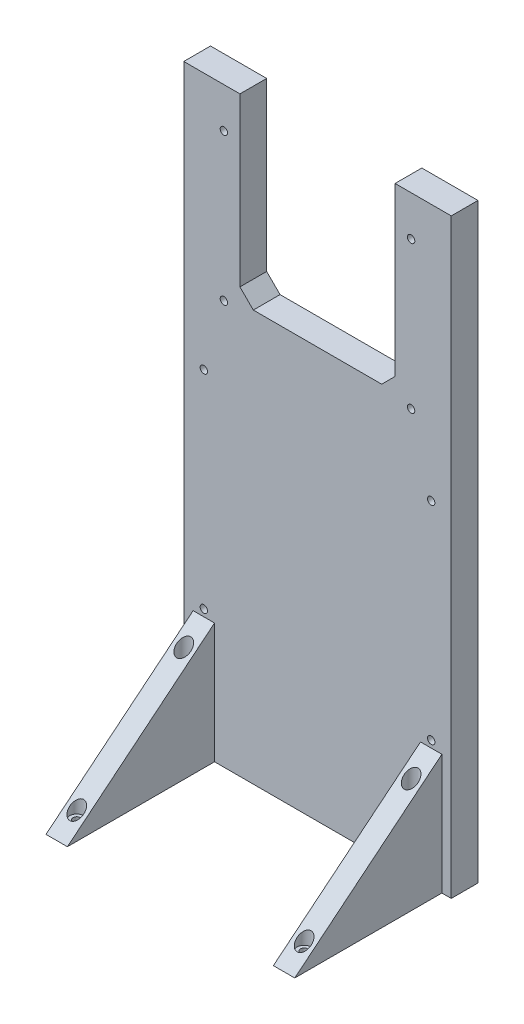
ISO-10303-21;
HEADER;
FILE_DESCRIPTION(('STEP AP214'),'2;1');
FILE_NAME('part.step','',(''),(''),'','','');
FILE_SCHEMA(('AUTOMOTIVE_DESIGN { 1 0 10303 214 1 1 1 1 }'));
ENDSEC;
DATA;
#1=APPLICATION_CONTEXT('core data for automotive mechanical design processes');
#2=APPLICATION_PROTOCOL_DEFINITION('international standard','automotive_design',2000,#1);
#3=PRODUCT_CONTEXT('',#1,'mechanical');
#4=PRODUCT('Part','Part','',(#3));
#5=PRODUCT_RELATED_PRODUCT_CATEGORY('part','',(#4));
#6=PRODUCT_DEFINITION_FORMATION('','',#4);
#7=PRODUCT_DEFINITION_CONTEXT('part definition',#1,'design');
#8=PRODUCT_DEFINITION('design','',#6,#7);
#9=PRODUCT_DEFINITION_SHAPE('','',#8);
#10=(LENGTH_UNIT() NAMED_UNIT(*) SI_UNIT(.MILLI.,.METRE.));
#11=(NAMED_UNIT(*) PLANE_ANGLE_UNIT() SI_UNIT($,.RADIAN.));
#12=(NAMED_UNIT(*) SI_UNIT($,.STERADIAN.) SOLID_ANGLE_UNIT());
#13=UNCERTAINTY_MEASURE_WITH_UNIT(LENGTH_MEASURE(1.E-05),#10,'distance_accuracy_value','');
#14=(GEOMETRIC_REPRESENTATION_CONTEXT(3) GLOBAL_UNCERTAINTY_ASSIGNED_CONTEXT((#13)) GLOBAL_UNIT_ASSIGNED_CONTEXT((#10,
#11,#12)) REPRESENTATION_CONTEXT('',''));
#15=CARTESIAN_POINT('',(0.,0.,0.));
#16=DIRECTION('',(0.,0.,1.));
#17=DIRECTION('',(1.,0.,0.));
#18=AXIS2_PLACEMENT_3D('',#15,#16,#17);
#19=CARTESIAN_POINT('',(0.,0.,0.));
#20=DIRECTION('',(0.,0.,1.));
#21=DIRECTION('',(1.,0.,0.));
#22=AXIS2_PLACEMENT_3D('',#19,#20,#21);
#23=PLANE('',#22);
#24=CARTESIAN_POINT('',(-35.,40.52,0.));
#25=DIRECTION('',(0.,0.,1.));
#26=DIRECTION('',(1.,0.,0.));
#27=AXIS2_PLACEMENT_3D('',#24,#25,#26);
#28=CIRCLE('',#27,1.375);
#29=CARTESIAN_POINT('',(-33.625,40.52,0.));
#30=VERTEX_POINT('',#29);
#31=EDGE_CURVE('E1003',#30,#30,#28,.F.);
#32=ORIENTED_EDGE('',*,*,#31,.F.);
#33=EDGE_LOOP('',(#32));
#34=FACE_BOUND('',#33,.T.);
#35=CARTESIAN_POINT('',(35.,40.52,0.));
#36=DIRECTION('',(0.,0.,1.));
#37=DIRECTION('',(1.,0.,0.));
#38=AXIS2_PLACEMENT_3D('',#35,#36,#37);
#39=CIRCLE('',#38,1.375);
#40=CARTESIAN_POINT('',(36.375,40.52,0.));
#41=VERTEX_POINT('',#40);
#42=EDGE_CURVE('E1007',#41,#41,#39,.F.);
#43=ORIENTED_EDGE('',*,*,#42,.F.);
#44=EDGE_LOOP('',(#43));
#45=FACE_BOUND('',#44,.T.);
#46=CARTESIAN_POINT('',(35.,95.5,0.));
#47=DIRECTION('',(0.,0.,1.));
#48=DIRECTION('',(1.,0.,0.));
#49=AXIS2_PLACEMENT_3D('',#46,#47,#48);
#50=CIRCLE('',#49,1.375);
#51=CARTESIAN_POINT('',(36.375,95.5,0.));
#52=VERTEX_POINT('',#51);
#53=EDGE_CURVE('E1031',#52,#52,#50,.F.);
#54=ORIENTED_EDGE('',*,*,#53,.F.);
#55=EDGE_LOOP('',(#54));
#56=FACE_BOUND('',#55,.T.);
#57=CARTESIAN_POINT('',(-35.,95.5,0.));
#58=DIRECTION('',(0.,0.,1.));
#59=DIRECTION('',(1.,0.,0.));
#60=AXIS2_PLACEMENT_3D('',#57,#58,#59);
#61=CIRCLE('',#60,1.375);
#62=CARTESIAN_POINT('',(-33.625,95.5,0.));
#63=VERTEX_POINT('',#62);
#64=EDGE_CURVE('E549',#63,#63,#61,.F.);
#65=ORIENTED_EDGE('',*,*,#64,.F.);
#66=EDGE_LOOP('',(#65));
#67=FACE_BOUND('',#66,.T.);
#68=CARTESIAN_POINT('',(42.5000000000001,-63.,0.));
#69=DIRECTION('',(0.,0.,1.));
#70=DIRECTION('',(1.,0.,0.));
#71=AXIS2_PLACEMENT_3D('',#68,#69,#70);
#72=CIRCLE('',#71,1.375);
#73=CARTESIAN_POINT('',(43.8750000000001,-63.,0.));
#74=VERTEX_POINT('',#73);
#75=EDGE_CURVE('E264',#74,#74,#72,.F.);
#76=ORIENTED_EDGE('',*,*,#75,.F.);
#77=EDGE_LOOP('',(#76));
#78=FACE_BOUND('',#77,.T.);
#79=CARTESIAN_POINT('',(42.5,14.5,0.));
#80=DIRECTION('',(0.,0.,1.));
#81=DIRECTION('',(1.,0.,0.));
#82=AXIS2_PLACEMENT_3D('',#79,#80,#81);
#83=CIRCLE('',#82,1.37500000000001);
#84=CARTESIAN_POINT('',(43.875,14.5,0.));
#85=VERTEX_POINT('',#84);
#86=EDGE_CURVE('E323',#85,#85,#83,.F.);
#87=ORIENTED_EDGE('',*,*,#86,.F.);
#88=EDGE_LOOP('',(#87));
#89=FACE_BOUND('',#88,.T.);
#90=DIRECTION('',(0.,1.,0.));
#91=VECTOR('',#90,1.);
#92=CARTESIAN_POINT('',(-29.,0.,0.));
#93=LINE('',#92,#91);
#94=CARTESIAN_POINT('',(-29.,48.01,0.));
#95=VERTEX_POINT('',#94);
#96=CARTESIAN_POINT('',(-29.,110.5,0.));
#97=VERTEX_POINT('',#96);
#98=EDGE_CURVE('E305',#95,#97,#93,.T.);
#99=ORIENTED_EDGE('',*,*,#98,.F.);
#100=DIRECTION('',(0.707106781186544,-0.707106781186551,0.));
#101=VECTOR('',#100,1.);
#102=CARTESIAN_POINT('',(9.50499999999984,9.50499999999974,0.));
#103=LINE('',#102,#101);
#104=CARTESIAN_POINT('',(-24.,43.01,0.));
#105=VERTEX_POINT('',#104);
#106=EDGE_CURVE('E352',#95,#105,#103,.T.);
#107=ORIENTED_EDGE('',*,*,#106,.T.);
#108=DIRECTION('',(1.,0.,0.));
#109=VECTOR('',#108,1.);
#110=CARTESIAN_POINT('',(0.,43.01,0.));
#111=LINE('',#110,#109);
#112=CARTESIAN_POINT('',(24.,43.01,0.));
#113=VERTEX_POINT('',#112);
#114=EDGE_CURVE('E302',#105,#113,#111,.T.);
#115=ORIENTED_EDGE('',*,*,#114,.T.);
#116=DIRECTION('',(-0.707106781186551,-0.707106781186544,0.));
#117=VECTOR('',#116,1.);
#118=CARTESIAN_POINT('',(-9.50500000000013,9.50500000000023,0.));
#119=LINE('',#118,#117);
#120=CARTESIAN_POINT('',(29.,48.0099999999999,0.));
#121=VERTEX_POINT('',#120);
#122=EDGE_CURVE('E356',#113,#121,#119,.F.);
#123=ORIENTED_EDGE('',*,*,#122,.T.);
#124=DIRECTION('',(0.,1.,0.));
#125=VECTOR('',#124,1.);
#126=CARTESIAN_POINT('',(29.,0.,0.));
#127=LINE('',#126,#125);
#128=CARTESIAN_POINT('',(29.,110.5,0.));
#129=VERTEX_POINT('',#128);
#130=EDGE_CURVE('E321',#121,#129,#127,.T.);
#131=ORIENTED_EDGE('',*,*,#130,.T.);
#132=DIRECTION('',(1.,0.,0.));
#133=VECTOR('',#132,1.);
#134=CARTESIAN_POINT('',(0.,110.5,0.));
#135=LINE('',#134,#133);
#136=CARTESIAN_POINT('',(50.,110.5,0.));
#137=VERTEX_POINT('',#136);
#138=EDGE_CURVE('E318',#129,#137,#135,.T.);
#139=ORIENTED_EDGE('',*,*,#138,.T.);
#140=DIRECTION('',(0.,1.,0.));
#141=VECTOR('',#140,1.);
#142=CARTESIAN_POINT('',(50.,0.,0.));
#143=LINE('',#142,#141);
#144=CARTESIAN_POINT('',(50.,-110.5,0.));
#145=VERTEX_POINT('',#144);
#146=EDGE_CURVE('E315',#145,#137,#143,.T.);
#147=ORIENTED_EDGE('',*,*,#146,.F.);
#148=DIRECTION('',(1.,0.,0.));
#149=VECTOR('',#148,1.);
#150=CARTESIAN_POINT('',(0.,-110.5,0.));
#151=LINE('',#150,#149);
#152=CARTESIAN_POINT('',(-50.,-110.5,0.));
#153=VERTEX_POINT('',#152);
#154=EDGE_CURVE('E313',#153,#145,#151,.T.);
#155=ORIENTED_EDGE('',*,*,#154,.F.);
#156=DIRECTION('',(0.,1.,0.));
#157=VECTOR('',#156,1.);
#158=CARTESIAN_POINT('',(-50.,0.,0.));
#159=LINE('',#158,#157);
#160=CARTESIAN_POINT('',(-50.,110.5,0.));
#161=VERTEX_POINT('',#160);
#162=EDGE_CURVE('E310',#153,#161,#159,.T.);
#163=ORIENTED_EDGE('',*,*,#162,.T.);
#164=DIRECTION('',(1.,0.,0.));
#165=VECTOR('',#164,1.);
#166=CARTESIAN_POINT('',(0.,110.5,0.));
#167=LINE('',#166,#165);
#168=EDGE_CURVE('E307',#161,#97,#167,.T.);
#169=ORIENTED_EDGE('',*,*,#168,.T.);
#170=EDGE_LOOP('',(#99,#107,#115,#123,#131,#139,#147,#155,#163,#169));
#171=FACE_BOUND('',#170,.T.);
#172=CARTESIAN_POINT('',(-42.5,14.5,0.));
#173=DIRECTION('',(0.,0.,1.));
#174=DIRECTION('',(1.,0.,0.));
#175=AXIS2_PLACEMENT_3D('',#172,#173,#174);
#176=CIRCLE('',#175,1.375);
#177=CARTESIAN_POINT('',(-41.125,14.5,0.));
#178=VERTEX_POINT('',#177);
#179=EDGE_CURVE('E299',#178,#178,#176,.T.);
#180=ORIENTED_EDGE('',*,*,#179,.T.);
#181=EDGE_LOOP('',(#180));
#182=FACE_BOUND('',#181,.T.);
#183=CARTESIAN_POINT('',(-42.5,-63.,0.));
#184=DIRECTION('',(0.,0.,1.));
#185=DIRECTION('',(1.,0.,0.));
#186=AXIS2_PLACEMENT_3D('',#183,#184,#185);
#187=CIRCLE('',#186,1.375);
#188=CARTESIAN_POINT('',(-41.125,-63.,0.));
#189=VERTEX_POINT('',#188);
#190=EDGE_CURVE('E259',#189,#189,#187,.T.);
#191=ORIENTED_EDGE('',*,*,#190,.T.);
#192=EDGE_LOOP('',(#191));
#193=FACE_BOUND('',#192,.T.);
#194=CARTESIAN_POINT('',(-42.5,-103.,0.));
#195=DIRECTION('',(0.,0.,1.));
#196=DIRECTION('',(1.,0.,0.));
#197=AXIS2_PLACEMENT_3D('',#194,#195,#196);
#198=CIRCLE('',#197,1.375);
#199=CARTESIAN_POINT('',(-41.125,-103.,0.));
#200=VERTEX_POINT('',#199);
#201=EDGE_CURVE('E533',#200,#200,#198,.T.);
#202=ORIENTED_EDGE('',*,*,#201,.T.);
#203=EDGE_LOOP('',(#202));
#204=FACE_BOUND('',#203,.T.);
#205=CARTESIAN_POINT('',(42.5000000000001,-103.,0.));
#206=DIRECTION('',(0.,0.,-1.));
#207=DIRECTION('',(-1.,0.,0.));
#208=AXIS2_PLACEMENT_3D('',#205,#206,#207);
#209=CIRCLE('',#208,1.37500000000001);
#210=CARTESIAN_POINT('',(41.1250000000001,-103.,0.));
#211=VERTEX_POINT('',#210);
#212=EDGE_CURVE('E536',#211,#211,#209,.T.);
#213=ORIENTED_EDGE('',*,*,#212,.F.);
#214=EDGE_LOOP('',(#213));
#215=FACE_BOUND('',#214,.T.);
#216=ADVANCED_FACE('F97',(#34,#45,#56,#67,#78,#89,#171,#182,#193,#204,#215),#23,.F.);
#217=CARTESIAN_POINT('',(42.5,-110.5,57.5));
#218=DIRECTION('',(0.,1.,0.));
#219=DIRECTION('',(0.,0.,1.));
#220=AXIS2_PLACEMENT_3D('',#217,#218,#219);
#221=CYLINDRICAL_SURFACE('',#220,1.375);
#222=CARTESIAN_POINT('',(42.5,-110.5,57.5));
#223=DIRECTION('',(0.,1.,0.));
#224=DIRECTION('',(0.,0.,1.));
#225=AXIS2_PLACEMENT_3D('',#222,#223,#224);
#226=CIRCLE('',#225,1.375);
#227=CARTESIAN_POINT('',(42.5,-110.5,58.875));
#228=VERTEX_POINT('',#227);
#229=EDGE_CURVE('E388',#228,#228,#226,.T.);
#230=ORIENTED_EDGE('',*,*,#229,.F.);
#231=EDGE_LOOP('',(#230));
#232=FACE_BOUND('',#231,.T.);
#233=CARTESIAN_POINT('',(42.5,-107.5,57.5));
#234=DIRECTION('',(0.,1.,0.));
#235=DIRECTION('',(-1.,0.,0.));
#236=AXIS2_PLACEMENT_3D('',#233,#234,#235);
#237=CIRCLE('',#236,1.375);
#238=CARTESIAN_POINT('',(41.125,-107.5,57.5));
#239=VERTEX_POINT('',#238);
#240=EDGE_CURVE('E369',#239,#239,#237,.F.);
#241=ORIENTED_EDGE('',*,*,#240,.F.);
#242=EDGE_LOOP('',(#241));
#243=FACE_BOUND('',#242,.T.);
#244=ADVANCED_FACE('F408',(#232,#243),#221,.F.);
#245=CARTESIAN_POINT('',(42.5,-110.5,17.5));
#246=DIRECTION('',(0.,1.,0.));
#247=DIRECTION('',(0.,0.,1.));
#248=AXIS2_PLACEMENT_3D('',#245,#246,#247);
#249=CYLINDRICAL_SURFACE('',#248,1.375);
#250=CARTESIAN_POINT('',(42.5,-110.5,17.5));
#251=DIRECTION('',(0.,1.,0.));
#252=DIRECTION('',(0.,0.,1.));
#253=AXIS2_PLACEMENT_3D('',#250,#251,#252);
#254=CIRCLE('',#253,1.375);
#255=CARTESIAN_POINT('',(42.5,-110.5,18.875));
#256=VERTEX_POINT('',#255);
#257=EDGE_CURVE('E384',#256,#256,#254,.T.);
#258=ORIENTED_EDGE('',*,*,#257,.F.);
#259=EDGE_LOOP('',(#258));
#260=FACE_BOUND('',#259,.T.);
#261=CARTESIAN_POINT('',(42.5,-107.5,17.5));
#262=DIRECTION('',(0.,1.,0.));
#263=DIRECTION('',(-1.,0.,0.));
#264=AXIS2_PLACEMENT_3D('',#261,#262,#263);
#265=CIRCLE('',#264,1.375);
#266=CARTESIAN_POINT('',(41.125,-107.5,17.5));
#267=VERTEX_POINT('',#266);
#268=EDGE_CURVE('E366',#267,#267,#265,.F.);
#269=ORIENTED_EDGE('',*,*,#268,.F.);
#270=EDGE_LOOP('',(#269));
#271=FACE_BOUND('',#270,.T.);
#272=ADVANCED_FACE('F414',(#260,#271),#249,.F.);
#273=CARTESIAN_POINT('',(-42.5,-110.5,17.5));
#274=DIRECTION('',(0.,1.,0.));
#275=DIRECTION('',(0.,0.,1.));
#276=AXIS2_PLACEMENT_3D('',#273,#274,#275);
#277=CYLINDRICAL_SURFACE('',#276,1.375);
#278=CARTESIAN_POINT('',(-42.5,-110.5,17.5));
#279=DIRECTION('',(0.,1.,0.));
#280=DIRECTION('',(0.,0.,1.));
#281=AXIS2_PLACEMENT_3D('',#278,#279,#280);
#282=CIRCLE('',#281,1.375);
#283=CARTESIAN_POINT('',(-42.5,-110.5,18.875));
#284=VERTEX_POINT('',#283);
#285=EDGE_CURVE('E244',#284,#284,#282,.T.);
#286=ORIENTED_EDGE('',*,*,#285,.F.);
#287=EDGE_LOOP('',(#286));
#288=FACE_BOUND('',#287,.T.);
#289=CARTESIAN_POINT('',(-42.5,-107.5,17.5));
#290=DIRECTION('',(0.,1.,0.));
#291=DIRECTION('',(-1.,0.,0.));
#292=AXIS2_PLACEMENT_3D('',#289,#290,#291);
#293=CIRCLE('',#292,1.375);
#294=CARTESIAN_POINT('',(-43.875,-107.5,17.5));
#295=VERTEX_POINT('',#294);
#296=EDGE_CURVE('E362',#295,#295,#293,.F.);
#297=ORIENTED_EDGE('',*,*,#296,.F.);
#298=EDGE_LOOP('',(#297));
#299=FACE_BOUND('',#298,.T.);
#300=ADVANCED_FACE('F605',(#288,#299),#277,.F.);
#301=CARTESIAN_POINT('',(-42.5,-110.5,57.5));
#302=DIRECTION('',(0.,1.,0.));
#303=DIRECTION('',(0.,0.,1.));
#304=AXIS2_PLACEMENT_3D('',#301,#302,#303);
#305=CYLINDRICAL_SURFACE('',#304,1.375);
#306=CARTESIAN_POINT('',(-42.5,-110.5,57.5));
#307=DIRECTION('',(0.,1.,0.));
#308=DIRECTION('',(0.,0.,1.));
#309=AXIS2_PLACEMENT_3D('',#306,#307,#308);
#310=CIRCLE('',#309,1.375);
#311=CARTESIAN_POINT('',(-42.5,-110.5,58.875));
#312=VERTEX_POINT('',#311);
#313=EDGE_CURVE('E560',#312,#312,#310,.T.);
#314=ORIENTED_EDGE('',*,*,#313,.F.);
#315=EDGE_LOOP('',(#314));
#316=FACE_BOUND('',#315,.T.);
#317=CARTESIAN_POINT('',(-42.5,-107.5,57.5));
#318=DIRECTION('',(0.,1.,0.));
#319=DIRECTION('',(-1.,0.,0.));
#320=AXIS2_PLACEMENT_3D('',#317,#318,#319);
#321=CIRCLE('',#320,1.375);
#322=CARTESIAN_POINT('',(-43.875,-107.5,57.5));
#323=VERTEX_POINT('',#322);
#324=EDGE_CURVE('E359',#323,#323,#321,.F.);
#325=ORIENTED_EDGE('',*,*,#324,.F.);
#326=EDGE_LOOP('',(#325));
#327=FACE_BOUND('',#326,.T.);
#328=ADVANCED_FACE('F603',(#316,#327),#305,.F.);
#329=CARTESIAN_POINT('',(0.,0.,10.));
#330=DIRECTION('',(0.,0.,1.));
#331=DIRECTION('',(1.,0.,0.));
#332=AXIS2_PLACEMENT_3D('',#329,#330,#331);
#333=PLANE('',#332);
#334=CARTESIAN_POINT('',(-35.,40.52,10.));
#335=DIRECTION('',(0.,0.,1.));
#336=DIRECTION('',(1.,0.,0.));
#337=AXIS2_PLACEMENT_3D('',#334,#335,#336);
#338=CIRCLE('',#337,1.375);
#339=CARTESIAN_POINT('',(-33.625,40.52,10.));
#340=VERTEX_POINT('',#339);
#341=EDGE_CURVE('E1006',#340,#340,#338,.T.);
#342=ORIENTED_EDGE('',*,*,#341,.F.);
#343=EDGE_LOOP('',(#342));
#344=FACE_BOUND('',#343,.T.);
#345=CARTESIAN_POINT('',(35.,40.52,10.));
#346=DIRECTION('',(0.,0.,1.));
#347=DIRECTION('',(1.,0.,0.));
#348=AXIS2_PLACEMENT_3D('',#345,#346,#347);
#349=CIRCLE('',#348,1.375);
#350=CARTESIAN_POINT('',(36.375,40.52,10.));
#351=VERTEX_POINT('',#350);
#352=EDGE_CURVE('E1010',#351,#351,#349,.T.);
#353=ORIENTED_EDGE('',*,*,#352,.F.);
#354=EDGE_LOOP('',(#353));
#355=FACE_BOUND('',#354,.T.);
#356=CARTESIAN_POINT('',(35.,95.5,10.));
#357=DIRECTION('',(0.,0.,1.));
#358=DIRECTION('',(1.,0.,0.));
#359=AXIS2_PLACEMENT_3D('',#356,#357,#358);
#360=CIRCLE('',#359,1.375);
#361=CARTESIAN_POINT('',(36.375,95.5,10.));
#362=VERTEX_POINT('',#361);
#363=EDGE_CURVE('E1017',#362,#362,#360,.T.);
#364=ORIENTED_EDGE('',*,*,#363,.F.);
#365=EDGE_LOOP('',(#364));
#366=FACE_BOUND('',#365,.T.);
#367=CARTESIAN_POINT('',(-35.,95.5,10.));
#368=DIRECTION('',(0.,0.,1.));
#369=DIRECTION('',(1.,0.,0.));
#370=AXIS2_PLACEMENT_3D('',#367,#368,#369);
#371=CIRCLE('',#370,1.375);
#372=CARTESIAN_POINT('',(-33.625,95.5,10.));
#373=VERTEX_POINT('',#372);
#374=EDGE_CURVE('E1015',#373,#373,#371,.T.);
#375=ORIENTED_EDGE('',*,*,#374,.F.);
#376=EDGE_LOOP('',(#375));
#377=FACE_BOUND('',#376,.T.);
#378=DIRECTION('',(0.,-1.,0.));
#379=VECTOR('',#378,1.);
#380=CARTESIAN_POINT('',(38.5,0.,10.));
#381=LINE('',#380,#379);
#382=CARTESIAN_POINT('',(38.5,-65.5631151562895,10.));
#383=VERTEX_POINT('',#382);
#384=CARTESIAN_POINT('',(38.5,-110.5,10.));
#385=VERTEX_POINT('',#384);
#386=EDGE_CURVE('E136',#383,#385,#381,.T.);
#387=ORIENTED_EDGE('',*,*,#386,.F.);
#388=DIRECTION('',(1.,0.,0.));
#389=VECTOR('',#388,1.);
#390=CARTESIAN_POINT('',(0.,-65.5631151562895,10.));
#391=LINE('',#390,#389);
#392=CARTESIAN_POINT('',(46.5,-65.5631151562895,10.));
#393=VERTEX_POINT('',#392);
#394=EDGE_CURVE('E107',#383,#393,#391,.T.);
#395=ORIENTED_EDGE('',*,*,#394,.T.);
#396=DIRECTION('',(0.,-1.,0.));
#397=VECTOR('',#396,1.);
#398=CARTESIAN_POINT('',(46.5,0.,10.));
#399=LINE('',#398,#397);
#400=CARTESIAN_POINT('',(46.5,-110.5,10.));
#401=VERTEX_POINT('',#400);
#402=EDGE_CURVE('E240',#393,#401,#399,.T.);
#403=ORIENTED_EDGE('',*,*,#402,.T.);
#404=DIRECTION('',(1.,0.,0.));
#405=VECTOR('',#404,1.);
#406=CARTESIAN_POINT('',(0.,-110.5,10.));
#407=LINE('',#406,#405);
#408=CARTESIAN_POINT('',(50.,-110.5,10.));
#409=VERTEX_POINT('',#408);
#410=EDGE_CURVE('E278',#401,#409,#407,.T.);
#411=ORIENTED_EDGE('',*,*,#410,.T.);
#412=DIRECTION('',(0.,1.,0.));
#413=VECTOR('',#412,1.);
#414=CARTESIAN_POINT('',(50.,0.,10.));
#415=LINE('',#414,#413);
#416=CARTESIAN_POINT('',(50.,110.5,10.));
#417=VERTEX_POINT('',#416);
#418=EDGE_CURVE('E282',#409,#417,#415,.T.);
#419=ORIENTED_EDGE('',*,*,#418,.T.);
#420=DIRECTION('',(1.,0.,0.));
#421=VECTOR('',#420,1.);
#422=CARTESIAN_POINT('',(0.,110.5,10.));
#423=LINE('',#422,#421);
#424=CARTESIAN_POINT('',(29.,110.5,10.));
#425=VERTEX_POINT('',#424);
#426=EDGE_CURVE('E285',#425,#417,#423,.T.);
#427=ORIENTED_EDGE('',*,*,#426,.F.);
#428=DIRECTION('',(0.,1.,0.));
#429=VECTOR('',#428,1.);
#430=CARTESIAN_POINT('',(29.,0.,10.));
#431=LINE('',#430,#429);
#432=CARTESIAN_POINT('',(29.,48.0099999999999,10.));
#433=VERTEX_POINT('',#432);
#434=EDGE_CURVE('E288',#433,#425,#431,.T.);
#435=ORIENTED_EDGE('',*,*,#434,.F.);
#436=DIRECTION('',(0.707106781186551,0.707106781186544,0.));
#437=VECTOR('',#436,1.);
#438=CARTESIAN_POINT('',(24.,43.01,10.));
#439=LINE('',#438,#437);
#440=CARTESIAN_POINT('',(24.,43.01,10.));
#441=VERTEX_POINT('',#440);
#442=EDGE_CURVE('E223',#433,#441,#439,.F.);
#443=ORIENTED_EDGE('',*,*,#442,.T.);
#444=DIRECTION('',(1.,0.,0.));
#445=VECTOR('',#444,1.);
#446=CARTESIAN_POINT('',(0.,43.01,10.));
#447=LINE('',#446,#445);
#448=CARTESIAN_POINT('',(-24.,43.01,10.));
#449=VERTEX_POINT('',#448);
#450=EDGE_CURVE('E267',#449,#441,#447,.T.);
#451=ORIENTED_EDGE('',*,*,#450,.F.);
#452=DIRECTION('',(-0.707106781186544,0.707106781186551,0.));
#453=VECTOR('',#452,1.);
#454=CARTESIAN_POINT('',(-29.,48.01,10.));
#455=LINE('',#454,#453);
#456=CARTESIAN_POINT('',(-29.,48.01,10.));
#457=VERTEX_POINT('',#456);
#458=EDGE_CURVE('E354',#449,#457,#455,.T.);
#459=ORIENTED_EDGE('',*,*,#458,.T.);
#460=DIRECTION('',(0.,1.,0.));
#461=VECTOR('',#460,1.);
#462=CARTESIAN_POINT('',(-29.,0.,10.));
#463=LINE('',#462,#461);
#464=CARTESIAN_POINT('',(-29.,110.5,10.));
#465=VERTEX_POINT('',#464);
#466=EDGE_CURVE('E270',#457,#465,#463,.T.);
#467=ORIENTED_EDGE('',*,*,#466,.T.);
#468=DIRECTION('',(1.,0.,0.));
#469=VECTOR('',#468,1.);
#470=CARTESIAN_POINT('',(0.,110.5,10.));
#471=LINE('',#470,#469);
#472=CARTESIAN_POINT('',(-50.,110.5,10.));
#473=VERTEX_POINT('',#472);
#474=EDGE_CURVE('E272',#473,#465,#471,.T.);
#475=ORIENTED_EDGE('',*,*,#474,.F.);
#476=DIRECTION('',(0.,1.,0.));
#477=VECTOR('',#476,1.);
#478=CARTESIAN_POINT('',(-50.,0.,10.));
#479=LINE('',#478,#477);
#480=CARTESIAN_POINT('',(-50.,-110.5,10.));
#481=VERTEX_POINT('',#480);
#482=EDGE_CURVE('E275',#481,#473,#479,.T.);
#483=ORIENTED_EDGE('',*,*,#482,.F.);
#484=CARTESIAN_POINT('',(-46.5,-110.5,10.));
#485=VERTEX_POINT('',#484);
#486=EDGE_CURVE('E279',#481,#485,#407,.T.);
#487=ORIENTED_EDGE('',*,*,#486,.T.);
#488=DIRECTION('',(0.,-1.,0.));
#489=VECTOR('',#488,1.);
#490=CARTESIAN_POINT('',(-46.5,0.,10.));
#491=LINE('',#490,#489);
#492=CARTESIAN_POINT('',(-46.5,-65.5631151562894,10.));
#493=VERTEX_POINT('',#492);
#494=EDGE_CURVE('E230',#493,#485,#491,.T.);
#495=ORIENTED_EDGE('',*,*,#494,.F.);
#496=DIRECTION('',(-1.,0.,0.));
#497=VECTOR('',#496,1.);
#498=CARTESIAN_POINT('',(0.,-65.5631151562894,10.));
#499=LINE('',#498,#497);
#500=CARTESIAN_POINT('',(-38.5,-65.5631151562894,10.));
#501=VERTEX_POINT('',#500);
#502=EDGE_CURVE('E13',#493,#501,#499,.F.);
#503=ORIENTED_EDGE('',*,*,#502,.T.);
#504=DIRECTION('',(0.,-1.,0.));
#505=VECTOR('',#504,1.);
#506=CARTESIAN_POINT('',(-38.5,0.,10.));
#507=LINE('',#506,#505);
#508=CARTESIAN_POINT('',(-38.5,-110.5,10.));
#509=VERTEX_POINT('',#508);
#510=EDGE_CURVE('E251',#501,#509,#507,.T.);
#511=ORIENTED_EDGE('',*,*,#510,.T.);
#512=EDGE_CURVE('E283',#509,#385,#407,.T.);
#513=ORIENTED_EDGE('',*,*,#512,.T.);
#514=EDGE_LOOP('',(#387,#395,#403,#411,#419,#427,#435,#443,#451,#459,#467,#475,#483,#487,#495,
#503,#511,#513));
#515=FACE_BOUND('',#514,.T.);
#516=CARTESIAN_POINT('',(-42.5,-63.,10.));
#517=DIRECTION('',(0.,0.,1.));
#518=DIRECTION('',(1.,0.,0.));
#519=AXIS2_PLACEMENT_3D('',#516,#517,#518);
#520=CIRCLE('',#519,1.375);
#521=CARTESIAN_POINT('',(-41.125,-63.,10.));
#522=VERTEX_POINT('',#521);
#523=EDGE_CURVE('E260',#522,#522,#520,.T.);
#524=ORIENTED_EDGE('',*,*,#523,.F.);
#525=EDGE_LOOP('',(#524));
#526=FACE_BOUND('',#525,.T.);
#527=CARTESIAN_POINT('',(-42.5,14.5,10.));
#528=DIRECTION('',(0.,0.,1.));
#529=DIRECTION('',(1.,0.,0.));
#530=AXIS2_PLACEMENT_3D('',#527,#528,#529);
#531=CIRCLE('',#530,1.375);
#532=CARTESIAN_POINT('',(-41.125,14.5,10.));
#533=VERTEX_POINT('',#532);
#534=EDGE_CURVE('E263',#533,#533,#531,.T.);
#535=ORIENTED_EDGE('',*,*,#534,.F.);
#536=EDGE_LOOP('',(#535));
#537=FACE_BOUND('',#536,.T.);
#538=CARTESIAN_POINT('',(42.5,14.5,10.));
#539=DIRECTION('',(0.,0.,1.));
#540=DIRECTION('',(1.,0.,0.));
#541=AXIS2_PLACEMENT_3D('',#538,#539,#540);
#542=CIRCLE('',#541,1.37500000000001);
#543=CARTESIAN_POINT('',(43.875,14.5,10.));
#544=VERTEX_POINT('',#543);
#545=EDGE_CURVE('E290',#544,#544,#542,.F.);
#546=ORIENTED_EDGE('',*,*,#545,.T.);
#547=EDGE_LOOP('',(#546));
#548=FACE_BOUND('',#547,.T.);
#549=CARTESIAN_POINT('',(42.5000000000001,-63.,10.));
#550=DIRECTION('',(0.,0.,1.));
#551=DIRECTION('',(1.,0.,0.));
#552=AXIS2_PLACEMENT_3D('',#549,#550,#551);
#553=CIRCLE('',#552,1.375);
#554=CARTESIAN_POINT('',(43.8750000000001,-63.,10.));
#555=VERTEX_POINT('',#554);
#556=EDGE_CURVE('E293',#555,#555,#553,.F.);
#557=ORIENTED_EDGE('',*,*,#556,.T.);
#558=EDGE_LOOP('',(#557));
#559=FACE_BOUND('',#558,.T.);
#560=ADVANCED_FACE('F421',(#344,#355,#366,#377,#515,#526,#537,#548,#559),#333,.T.);
#561=CARTESIAN_POINT('',(42.5000000000001,-63.,10.));
#562=DIRECTION('',(0.,0.,-1.));
#563=DIRECTION('',(-1.,0.,0.));
#564=AXIS2_PLACEMENT_3D('',#561,#562,#563);
#565=CYLINDRICAL_SURFACE('',#564,1.375);
#566=ORIENTED_EDGE('',*,*,#556,.F.);
#567=EDGE_LOOP('',(#566));
#568=FACE_BOUND('',#567,.T.);
#569=ORIENTED_EDGE('',*,*,#75,.T.);
#570=EDGE_LOOP('',(#569));
#571=FACE_BOUND('',#570,.T.);
#572=ADVANCED_FACE('F423',(#568,#571),#565,.F.);
#573=CARTESIAN_POINT('',(42.5,14.5,10.));
#574=DIRECTION('',(0.,0.,-1.));
#575=DIRECTION('',(-1.,0.,0.));
#576=AXIS2_PLACEMENT_3D('',#573,#574,#575);
#577=CYLINDRICAL_SURFACE('',#576,1.37500000000001);
#578=ORIENTED_EDGE('',*,*,#545,.F.);
#579=EDGE_LOOP('',(#578));
#580=FACE_BOUND('',#579,.T.);
#581=ORIENTED_EDGE('',*,*,#86,.T.);
#582=EDGE_LOOP('',(#581));
#583=FACE_BOUND('',#582,.T.);
#584=ADVANCED_FACE('F426',(#580,#583),#577,.F.);
#585=CARTESIAN_POINT('',(-29.,0.,10.));
#586=DIRECTION('',(-1.,0.,0.));
#587=DIRECTION('',(0.,0.,1.));
#588=AXIS2_PLACEMENT_3D('',#585,#586,#587);
#589=PLANE('',#588);
#590=ORIENTED_EDGE('',*,*,#466,.F.);
#591=DIRECTION('',(0.,0.,-1.));
#592=VECTOR('',#591,1.);
#593=CARTESIAN_POINT('',(-29.,48.01,10.));
#594=LINE('',#593,#592);
#595=EDGE_CURVE('E342',#457,#95,#594,.T.);
#596=ORIENTED_EDGE('',*,*,#595,.T.);
#597=ORIENTED_EDGE('',*,*,#98,.T.);
#598=DIRECTION('',(0.,0.,-1.));
#599=VECTOR('',#598,1.);
#600=CARTESIAN_POINT('',(-29.,110.5,10.));
#601=LINE('',#600,#599);
#602=EDGE_CURVE('E339',#465,#97,#601,.T.);
#603=ORIENTED_EDGE('',*,*,#602,.F.);
#604=EDGE_LOOP('',(#590,#596,#597,#603));
#605=FACE_BOUND('',#604,.T.);
#606=ADVANCED_FACE('F430',(#605),#589,.F.);
#607=CARTESIAN_POINT('',(0.,110.5,10.));
#608=DIRECTION('',(0.,1.,0.));
#609=DIRECTION('',(0.,0.,1.));
#610=AXIS2_PLACEMENT_3D('',#607,#608,#609);
#611=PLANE('',#610);
#612=ORIENTED_EDGE('',*,*,#168,.F.);
#613=DIRECTION('',(0.,0.,-1.));
#614=VECTOR('',#613,1.);
#615=CARTESIAN_POINT('',(-50.,110.5,10.));
#616=LINE('',#615,#614);
#617=EDGE_CURVE('E337',#473,#161,#616,.T.);
#618=ORIENTED_EDGE('',*,*,#617,.F.);
#619=ORIENTED_EDGE('',*,*,#474,.T.);
#620=ORIENTED_EDGE('',*,*,#602,.T.);
#621=EDGE_LOOP('',(#612,#618,#619,#620));
#622=FACE_BOUND('',#621,.T.);
#623=ADVANCED_FACE('F451',(#622),#611,.T.);
#624=CARTESIAN_POINT('',(-50.,0.,10.));
#625=DIRECTION('',(-1.,0.,0.));
#626=DIRECTION('',(0.,0.,1.));
#627=AXIS2_PLACEMENT_3D('',#624,#625,#626);
#628=PLANE('',#627);
#629=ORIENTED_EDGE('',*,*,#162,.F.);
#630=DIRECTION('',(0.,0.,-1.));
#631=VECTOR('',#630,1.);
#632=CARTESIAN_POINT('',(-50.,-110.5,10.));
#633=LINE('',#632,#631);
#634=EDGE_CURVE('E335',#481,#153,#633,.T.);
#635=ORIENTED_EDGE('',*,*,#634,.F.);
#636=ORIENTED_EDGE('',*,*,#482,.T.);
#637=ORIENTED_EDGE('',*,*,#617,.T.);
#638=EDGE_LOOP('',(#629,#635,#636,#637));
#639=FACE_BOUND('',#638,.T.);
#640=ADVANCED_FACE('F447',(#639),#628,.T.);
#641=CARTESIAN_POINT('',(0.,-110.5,10.));
#642=DIRECTION('',(0.,1.,0.));
#643=DIRECTION('',(-1.,0.,0.));
#644=AXIS2_PLACEMENT_3D('',#641,#642,#643);
#645=PLANE('',#644);
#646=ORIENTED_EDGE('',*,*,#257,.T.);
#647=EDGE_LOOP('',(#646));
#648=FACE_BOUND('',#647,.T.);
#649=ORIENTED_EDGE('',*,*,#229,.T.);
#650=EDGE_LOOP('',(#649));
#651=FACE_BOUND('',#650,.T.);
#652=ORIENTED_EDGE('',*,*,#313,.T.);
#653=EDGE_LOOP('',(#652));
#654=FACE_BOUND('',#653,.T.);
#655=ORIENTED_EDGE('',*,*,#285,.T.);
#656=EDGE_LOOP('',(#655));
#657=FACE_BOUND('',#656,.T.);
#658=ORIENTED_EDGE('',*,*,#154,.T.);
#659=DIRECTION('',(0.,0.,-1.));
#660=VECTOR('',#659,1.);
#661=CARTESIAN_POINT('',(50.,-110.5,10.));
#662=LINE('',#661,#660);
#663=EDGE_CURVE('E332',#409,#145,#662,.T.);
#664=ORIENTED_EDGE('',*,*,#663,.F.);
#665=ORIENTED_EDGE('',*,*,#410,.F.);
#666=DIRECTION('',(0.,0.,-1.));
#667=VECTOR('',#666,1.);
#668=CARTESIAN_POINT('',(46.5,-110.5,65.));
#669=LINE('',#668,#667);
#670=CARTESIAN_POINT('',(46.5,-110.5,65.));
#671=VERTEX_POINT('',#670);
#672=EDGE_CURVE('E231',#671,#401,#669,.T.);
#673=ORIENTED_EDGE('',*,*,#672,.F.);
#674=DIRECTION('',(1.,0.,0.));
#675=VECTOR('',#674,1.);
#676=CARTESIAN_POINT('',(0.,-110.5,65.));
#677=LINE('',#676,#675);
#678=CARTESIAN_POINT('',(38.5,-110.5,65.));
#679=VERTEX_POINT('',#678);
#680=EDGE_CURVE('E221',#679,#671,#677,.T.);
#681=ORIENTED_EDGE('',*,*,#680,.F.);
#682=DIRECTION('',(0.,0.,-1.));
#683=VECTOR('',#682,1.);
#684=CARTESIAN_POINT('',(38.5,-110.5,65.));
#685=LINE('',#684,#683);
#686=EDGE_CURVE('E226',#679,#385,#685,.T.);
#687=ORIENTED_EDGE('',*,*,#686,.T.);
#688=ORIENTED_EDGE('',*,*,#512,.F.);
#689=DIRECTION('',(0.,0.,-1.));
#690=VECTOR('',#689,1.);
#691=CARTESIAN_POINT('',(-38.5,-110.5,65.));
#692=LINE('',#691,#690);
#693=CARTESIAN_POINT('',(-38.5,-110.5,65.));
#694=VERTEX_POINT('',#693);
#695=EDGE_CURVE('E250',#694,#509,#692,.T.);
#696=ORIENTED_EDGE('',*,*,#695,.F.);
#697=DIRECTION('',(1.,0.,0.));
#698=VECTOR('',#697,1.);
#699=CARTESIAN_POINT('',(0.,-110.5,65.));
#700=LINE('',#699,#698);
#701=CARTESIAN_POINT('',(-46.5,-110.5,65.));
#702=VERTEX_POINT('',#701);
#703=EDGE_CURVE('E247',#702,#694,#700,.T.);
#704=ORIENTED_EDGE('',*,*,#703,.F.);
#705=DIRECTION('',(0.,0.,-1.));
#706=VECTOR('',#705,1.);
#707=CARTESIAN_POINT('',(-46.5,-110.5,65.));
#708=LINE('',#707,#706);
#709=EDGE_CURVE('E256',#702,#485,#708,.T.);
#710=ORIENTED_EDGE('',*,*,#709,.T.);
#711=ORIENTED_EDGE('',*,*,#486,.F.);
#712=ORIENTED_EDGE('',*,*,#634,.T.);
#713=EDGE_LOOP('',(#658,#664,#665,#673,#681,#687,#688,#696,#704,#710,#711,#712));
#714=FACE_BOUND('',#713,.T.);
#715=ADVANCED_FACE('F235',(#648,#651,#654,#657,#714),#645,.F.);
#716=CARTESIAN_POINT('',(50.,0.,10.));
#717=DIRECTION('',(-1.,0.,0.));
#718=DIRECTION('',(0.,-1.,0.));
#719=AXIS2_PLACEMENT_3D('',#716,#717,#718);
#720=PLANE('',#719);
#721=ORIENTED_EDGE('',*,*,#146,.T.);
#722=DIRECTION('',(0.,0.,-1.));
#723=VECTOR('',#722,1.);
#724=CARTESIAN_POINT('',(50.,110.5,10.));
#725=LINE('',#724,#723);
#726=EDGE_CURVE('E330',#417,#137,#725,.T.);
#727=ORIENTED_EDGE('',*,*,#726,.F.);
#728=ORIENTED_EDGE('',*,*,#418,.F.);
#729=ORIENTED_EDGE('',*,*,#663,.T.);
#730=EDGE_LOOP('',(#721,#727,#728,#729));
#731=FACE_BOUND('',#730,.T.);
#732=ADVANCED_FACE('F440',(#731),#720,.F.);
#733=CARTESIAN_POINT('',(0.,110.5,10.));
#734=DIRECTION('',(0.,1.,0.));
#735=DIRECTION('',(0.,0.,1.));
#736=AXIS2_PLACEMENT_3D('',#733,#734,#735);
#737=PLANE('',#736);
#738=ORIENTED_EDGE('',*,*,#138,.F.);
#739=DIRECTION('',(0.,0.,-1.));
#740=VECTOR('',#739,1.);
#741=CARTESIAN_POINT('',(29.,110.5,10.));
#742=LINE('',#741,#740);
#743=EDGE_CURVE('E296',#425,#129,#742,.T.);
#744=ORIENTED_EDGE('',*,*,#743,.F.);
#745=ORIENTED_EDGE('',*,*,#426,.T.);
#746=ORIENTED_EDGE('',*,*,#726,.T.);
#747=EDGE_LOOP('',(#738,#744,#745,#746));
#748=FACE_BOUND('',#747,.T.);
#749=ADVANCED_FACE('F436',(#748),#737,.T.);
#750=CARTESIAN_POINT('',(29.,0.,10.));
#751=DIRECTION('',(-1.,0.,0.));
#752=DIRECTION('',(0.,-1.,0.));
#753=AXIS2_PLACEMENT_3D('',#750,#751,#752);
#754=PLANE('',#753);
#755=ORIENTED_EDGE('',*,*,#130,.F.);
#756=DIRECTION('',(0.,0.,1.));
#757=VECTOR('',#756,1.);
#758=CARTESIAN_POINT('',(29.,48.0099999999999,10.));
#759=LINE('',#758,#757);
#760=EDGE_CURVE('E350',#121,#433,#759,.T.);
#761=ORIENTED_EDGE('',*,*,#760,.T.);
#762=ORIENTED_EDGE('',*,*,#434,.T.);
#763=ORIENTED_EDGE('',*,*,#743,.T.);
#764=EDGE_LOOP('',(#755,#761,#762,#763));
#765=FACE_BOUND('',#764,.T.);
#766=ADVANCED_FACE('F432',(#765),#754,.T.);
#767=CARTESIAN_POINT('',(0.,43.01,10.));
#768=DIRECTION('',(0.,1.,0.));
#769=DIRECTION('',(0.,0.,1.));
#770=AXIS2_PLACEMENT_3D('',#767,#768,#769);
#771=PLANE('',#770);
#772=ORIENTED_EDGE('',*,*,#114,.F.);
#773=DIRECTION('',(0.,0.,1.));
#774=VECTOR('',#773,1.);
#775=CARTESIAN_POINT('',(-24.,43.01,10.));
#776=LINE('',#775,#774);
#777=EDGE_CURVE('E348',#105,#449,#776,.T.);
#778=ORIENTED_EDGE('',*,*,#777,.T.);
#779=ORIENTED_EDGE('',*,*,#450,.T.);
#780=DIRECTION('',(0.,0.,-1.));
#781=VECTOR('',#780,1.);
#782=CARTESIAN_POINT('',(24.,43.01,0.));
#783=LINE('',#782,#781);
#784=EDGE_CURVE('E345',#441,#113,#783,.T.);
#785=ORIENTED_EDGE('',*,*,#784,.T.);
#786=EDGE_LOOP('',(#772,#778,#779,#785));
#787=FACE_BOUND('',#786,.T.);
#788=ADVANCED_FACE('F435',(#787),#771,.T.);
#789=CARTESIAN_POINT('',(-42.5,14.5,10.));
#790=DIRECTION('',(0.,0.,-1.));
#791=DIRECTION('',(-1.,0.,0.));
#792=AXIS2_PLACEMENT_3D('',#789,#790,#791);
#793=CYLINDRICAL_SURFACE('',#792,1.375);
#794=ORIENTED_EDGE('',*,*,#534,.T.);
#795=EDGE_LOOP('',(#794));
#796=FACE_BOUND('',#795,.T.);
#797=ORIENTED_EDGE('',*,*,#179,.F.);
#798=EDGE_LOOP('',(#797));
#799=FACE_BOUND('',#798,.T.);
#800=ADVANCED_FACE('F461',(#796,#799),#793,.F.);
#801=CARTESIAN_POINT('',(-42.5,-63.,10.));
#802=DIRECTION('',(0.,0.,-1.));
#803=DIRECTION('',(-1.,0.,0.));
#804=AXIS2_PLACEMENT_3D('',#801,#802,#803);
#805=CYLINDRICAL_SURFACE('',#804,1.375);
#806=ORIENTED_EDGE('',*,*,#523,.T.);
#807=EDGE_LOOP('',(#806));
#808=FACE_BOUND('',#807,.T.);
#809=ORIENTED_EDGE('',*,*,#190,.F.);
#810=EDGE_LOOP('',(#809));
#811=FACE_BOUND('',#810,.T.);
#812=ADVANCED_FACE('F465',(#808,#811),#805,.F.);
#813=CARTESIAN_POINT('',(-29.,48.01,10.));
#814=DIRECTION('',(-0.707106781186551,-0.707106781186544,0.));
#815=DIRECTION('',(0.,0.,-1.));
#816=AXIS2_PLACEMENT_3D('',#813,#814,#815);
#817=PLANE('',#816);
#818=ORIENTED_EDGE('',*,*,#458,.F.);
#819=ORIENTED_EDGE('',*,*,#777,.F.);
#820=ORIENTED_EDGE('',*,*,#106,.F.);
#821=ORIENTED_EDGE('',*,*,#595,.F.);
#822=EDGE_LOOP('',(#818,#819,#820,#821));
#823=FACE_BOUND('',#822,.T.);
#824=ADVANCED_FACE('F469',(#823),#817,.F.);
#825=CARTESIAN_POINT('',(24.,43.01,10.));
#826=DIRECTION('',(-0.707106781186544,0.707106781186551,0.));
#827=DIRECTION('',(0.,0.,1.));
#828=AXIS2_PLACEMENT_3D('',#825,#826,#827);
#829=PLANE('',#828);
#830=ORIENTED_EDGE('',*,*,#442,.F.);
#831=ORIENTED_EDGE('',*,*,#760,.F.);
#832=ORIENTED_EDGE('',*,*,#122,.F.);
#833=ORIENTED_EDGE('',*,*,#784,.F.);
#834=EDGE_LOOP('',(#830,#831,#832,#833));
#835=FACE_BOUND('',#834,.T.);
#836=ADVANCED_FACE('F477',(#835),#829,.T.);
#837=CARTESIAN_POINT('',(-46.5,0.,65.));
#838=DIRECTION('',(1.,0.,0.));
#839=DIRECTION('',(0.,0.,-1.));
#840=AXIS2_PLACEMENT_3D('',#837,#838,#839);
#841=PLANE('',#840);
#842=ORIENTED_EDGE('',*,*,#709,.F.);
#843=DIRECTION('',(0.,-0.632705328562512,0.774392644082189));
#844=VECTOR('',#843,1.);
#845=CARTESIAN_POINT('',(-46.5,-65.5000000000001,9.92275090701126));
#846=LINE('',#845,#844);
#847=EDGE_CURVE('E115',#702,#493,#846,.F.);
#848=ORIENTED_EDGE('',*,*,#847,.T.);
#849=ORIENTED_EDGE('',*,*,#494,.T.);
#850=EDGE_LOOP('',(#842,#848,#849));
#851=FACE_BOUND('',#850,.T.);
#852=ADVANCED_FACE('F483',(#851),#841,.F.);
#853=CARTESIAN_POINT('',(-38.5,0.,65.));
#854=DIRECTION('',(1.,0.,0.));
#855=DIRECTION('',(0.,0.,-1.));
#856=AXIS2_PLACEMENT_3D('',#853,#854,#855);
#857=PLANE('',#856);
#858=ORIENTED_EDGE('',*,*,#510,.F.);
#859=DIRECTION('',(0.,0.632705328562512,-0.774392644082189));
#860=VECTOR('',#859,1.);
#861=CARTESIAN_POINT('',(-38.5,-66.2650783765509,10.8591600696991));
#862=LINE('',#861,#860);
#863=EDGE_CURVE('E374',#501,#694,#862,.F.);
#864=ORIENTED_EDGE('',*,*,#863,.T.);
#865=ORIENTED_EDGE('',*,*,#695,.T.);
#866=EDGE_LOOP('',(#858,#864,#865));
#867=FACE_BOUND('',#866,.T.);
#868=ADVANCED_FACE('F492',(#867),#857,.T.);
#869=CARTESIAN_POINT('',(46.5,0.,65.));
#870=DIRECTION('',(1.,0.,0.));
#871=DIRECTION('',(0.,1.,0.));
#872=AXIS2_PLACEMENT_3D('',#869,#870,#871);
#873=PLANE('',#872);
#874=ORIENTED_EDGE('',*,*,#402,.F.);
#875=DIRECTION('',(0.,-0.632705328562512,0.774392644082189));
#876=VECTOR('',#875,1.);
#877=CARTESIAN_POINT('',(46.5,-66.2650783765509,10.859160069699));
#878=LINE('',#877,#876);
#879=EDGE_CURVE('E222',#393,#671,#878,.T.);
#880=ORIENTED_EDGE('',*,*,#879,.T.);
#881=ORIENTED_EDGE('',*,*,#672,.T.);
#882=EDGE_LOOP('',(#874,#880,#881));
#883=FACE_BOUND('',#882,.T.);
#884=ADVANCED_FACE('F617',(#883),#873,.T.);
#885=CARTESIAN_POINT('',(38.5,0.,65.));
#886=DIRECTION('',(1.,0.,0.));
#887=DIRECTION('',(0.,1.,0.));
#888=AXIS2_PLACEMENT_3D('',#885,#886,#887);
#889=PLANE('',#888);
#890=ORIENTED_EDGE('',*,*,#686,.F.);
#891=DIRECTION('',(0.,0.632705328562512,-0.774392644082189));
#892=VECTOR('',#891,1.);
#893=CARTESIAN_POINT('',(38.5,-110.5,65.));
#894=LINE('',#893,#892);
#895=EDGE_CURVE('E133',#679,#383,#894,.T.);
#896=ORIENTED_EDGE('',*,*,#895,.T.);
#897=ORIENTED_EDGE('',*,*,#386,.T.);
#898=EDGE_LOOP('',(#890,#896,#897));
#899=FACE_BOUND('',#898,.T.);
#900=ADVANCED_FACE('F227',(#899),#889,.F.);
#901=CARTESIAN_POINT('',(0.,-107.5,10.));
#902=DIRECTION('',(0.,1.,0.));
#903=DIRECTION('',(-1.,0.,0.));
#904=AXIS2_PLACEMENT_3D('',#901,#902,#903);
#905=PLANE('',#904);
#906=CARTESIAN_POINT('',(-42.5,-107.5,57.5));
#907=DIRECTION('',(0.,1.,0.));
#908=DIRECTION('',(-1.,0.,0.));
#909=AXIS2_PLACEMENT_3D('',#906,#907,#908);
#910=CIRCLE('',#909,2.6);
#911=CARTESIAN_POINT('',(-45.1,-107.5,57.5));
#912=VERTEX_POINT('',#911);
#913=EDGE_CURVE('E550',#912,#912,#910,.F.);
#914=ORIENTED_EDGE('',*,*,#913,.F.);
#915=EDGE_LOOP('',(#914));
#916=FACE_BOUND('',#915,.T.);
#917=ORIENTED_EDGE('',*,*,#324,.T.);
#918=EDGE_LOOP('',(#917));
#919=FACE_BOUND('',#918,.T.);
#920=ADVANCED_FACE('F616',(#916,#919),#905,.T.);
#921=CARTESIAN_POINT('',(-42.5,-117.85391052434,57.5));
#922=DIRECTION('',(0.,1.,0.));
#923=DIRECTION('',(0.,0.,1.));
#924=AXIS2_PLACEMENT_3D('',#921,#922,#923);
#925=CYLINDRICAL_SURFACE('',#924,2.6);
#926=CARTESIAN_POINT('',(-42.5,-104.372242975858,57.5));
#927=DIRECTION('',(0.,-0.774392644082189,-0.632705328562512));
#928=DIRECTION('',(0.,0.632705328562512,-0.774392644082189));
#929=AXIS2_PLACEMENT_3D('',#926,#927,#928);
#930=ELLIPSE('',#929,3.35746990866826,2.6);
#931=CARTESIAN_POINT('',(-42.5,-102.247953874155,54.9));
#932=VERTEX_POINT('',#931);
#933=EDGE_CURVE('E382',#932,#932,#930,.F.);
#934=ORIENTED_EDGE('',*,*,#933,.T.);
#935=EDGE_LOOP('',(#934));
#936=FACE_BOUND('',#935,.T.);
#937=ORIENTED_EDGE('',*,*,#913,.T.);
#938=EDGE_LOOP('',(#937));
#939=FACE_BOUND('',#938,.T.);
#940=ADVANCED_FACE('F599',(#936,#939),#925,.F.);
#941=CARTESIAN_POINT('',(0.,-107.5,10.));
#942=DIRECTION('',(0.,1.,0.));
#943=DIRECTION('',(-1.,0.,0.));
#944=AXIS2_PLACEMENT_3D('',#941,#942,#943);
#945=PLANE('',#944);
#946=CARTESIAN_POINT('',(-42.5,-107.5,17.5));
#947=DIRECTION('',(0.,1.,0.));
#948=DIRECTION('',(-1.,0.,0.));
#949=AXIS2_PLACEMENT_3D('',#946,#947,#948);
#950=CIRCLE('',#949,2.6);
#951=CARTESIAN_POINT('',(-45.1,-107.5,17.5));
#952=VERTEX_POINT('',#951);
#953=EDGE_CURVE('E363',#952,#952,#950,.F.);
#954=ORIENTED_EDGE('',*,*,#953,.F.);
#955=EDGE_LOOP('',(#954));
#956=FACE_BOUND('',#955,.T.);
#957=ORIENTED_EDGE('',*,*,#296,.T.);
#958=EDGE_LOOP('',(#957));
#959=FACE_BOUND('',#958,.T.);
#960=ADVANCED_FACE('F596',(#956,#959),#945,.T.);
#961=CARTESIAN_POINT('',(-42.5,-117.85391052434,17.5));
#962=DIRECTION('',(0.,1.,0.));
#963=DIRECTION('',(0.,0.,1.));
#964=AXIS2_PLACEMENT_3D('',#961,#962,#963);
#965=CYLINDRICAL_SURFACE('',#964,2.6);
#966=CARTESIAN_POINT('',(-42.5,-71.6908721804319,17.5));
#967=DIRECTION('',(0.,-0.774392644082189,-0.632705328562512));
#968=DIRECTION('',(0.,0.632705328562512,-0.774392644082189));
#969=AXIS2_PLACEMENT_3D('',#966,#967,#968);
#970=ELLIPSE('',#969,3.35746990866826,2.6);
#971=CARTESIAN_POINT('',(-42.5,-69.5665830787292,14.9));
#972=VERTEX_POINT('',#971);
#973=EDGE_CURVE('E102',#972,#972,#970,.F.);
#974=ORIENTED_EDGE('',*,*,#973,.T.);
#975=EDGE_LOOP('',(#974));
#976=FACE_BOUND('',#975,.T.);
#977=ORIENTED_EDGE('',*,*,#953,.T.);
#978=EDGE_LOOP('',(#977));
#979=FACE_BOUND('',#978,.T.);
#980=ADVANCED_FACE('F392',(#976,#979),#965,.F.);
#981=CARTESIAN_POINT('',(42.5,-117.85391052434,17.5));
#982=DIRECTION('',(0.,1.,0.));
#983=DIRECTION('',(0.,0.,1.));
#984=AXIS2_PLACEMENT_3D('',#981,#982,#983);
#985=CYLINDRICAL_SURFACE('',#984,2.6);
#986=CARTESIAN_POINT('',(42.5,-107.5,17.5));
#987=DIRECTION('',(0.,1.,0.));
#988=DIRECTION('',(-1.,0.,0.));
#989=AXIS2_PLACEMENT_3D('',#986,#987,#988);
#990=CIRCLE('',#989,2.6);
#991=CARTESIAN_POINT('',(39.9,-107.5,17.5));
#992=VERTEX_POINT('',#991);
#993=EDGE_CURVE('E541',#992,#992,#990,.F.);
#994=ORIENTED_EDGE('',*,*,#993,.T.);
#995=EDGE_LOOP('',(#994));
#996=FACE_BOUND('',#995,.T.);
#997=CARTESIAN_POINT('',(42.5,-71.6908721804319,17.5));
#998=DIRECTION('',(0.,0.774392644082189,0.632705328562512));
#999=DIRECTION('',(0.,0.632705328562512,-0.774392644082189));
#1000=AXIS2_PLACEMENT_3D('',#997,#998,#999);
#1001=ELLIPSE('',#1000,3.35746990866826,2.6);
#1002=CARTESIAN_POINT('',(42.5,-69.5665830787292,14.9));
#1003=VERTEX_POINT('',#1002);
#1004=EDGE_CURVE('E378',#1003,#1003,#1001,.F.);
#1005=ORIENTED_EDGE('',*,*,#1004,.F.);
#1006=EDGE_LOOP('',(#1005));
#1007=FACE_BOUND('',#1006,.T.);
#1008=ADVANCED_FACE('F589',(#996,#1007),#985,.F.);
#1009=CARTESIAN_POINT('',(0.,-107.5,10.));
#1010=DIRECTION('',(0.,1.,0.));
#1011=DIRECTION('',(-1.,0.,0.));
#1012=AXIS2_PLACEMENT_3D('',#1009,#1010,#1011);
#1013=PLANE('',#1012);
#1014=ORIENTED_EDGE('',*,*,#993,.F.);
#1015=EDGE_LOOP('',(#1014));
#1016=FACE_BOUND('',#1015,.T.);
#1017=ORIENTED_EDGE('',*,*,#268,.T.);
#1018=EDGE_LOOP('',(#1017));
#1019=FACE_BOUND('',#1018,.T.);
#1020=ADVANCED_FACE('F583',(#1016,#1019),#1013,.T.);
#1021=CARTESIAN_POINT('',(42.5,-117.85391052434,57.5));
#1022=DIRECTION('',(0.,1.,0.));
#1023=DIRECTION('',(0.,0.,1.));
#1024=AXIS2_PLACEMENT_3D('',#1021,#1022,#1023);
#1025=CYLINDRICAL_SURFACE('',#1024,2.6);
#1026=CARTESIAN_POINT('',(42.5,-107.5,57.5));
#1027=DIRECTION('',(0.,1.,0.));
#1028=DIRECTION('',(-1.,0.,0.));
#1029=AXIS2_PLACEMENT_3D('',#1026,#1027,#1028);
#1030=CIRCLE('',#1029,2.6);
#1031=CARTESIAN_POINT('',(39.9,-107.5,57.5));
#1032=VERTEX_POINT('',#1031);
#1033=EDGE_CURVE('E553',#1032,#1032,#1030,.F.);
#1034=ORIENTED_EDGE('',*,*,#1033,.T.);
#1035=EDGE_LOOP('',(#1034));
#1036=FACE_BOUND('',#1035,.T.);
#1037=CARTESIAN_POINT('',(42.5,-104.372242975858,57.5));
#1038=DIRECTION('',(0.,0.774392644082189,0.632705328562512));
#1039=DIRECTION('',(0.,0.632705328562512,-0.774392644082189));
#1040=AXIS2_PLACEMENT_3D('',#1037,#1038,#1039);
#1041=ELLIPSE('',#1040,3.35746990866826,2.6);
#1042=CARTESIAN_POINT('',(42.5,-102.247953874155,54.9));
#1043=VERTEX_POINT('',#1042);
#1044=EDGE_CURVE('E371',#1043,#1043,#1041,.F.);
#1045=ORIENTED_EDGE('',*,*,#1044,.F.);
#1046=EDGE_LOOP('',(#1045));
#1047=FACE_BOUND('',#1046,.T.);
#1048=ADVANCED_FACE('F573',(#1036,#1047),#1025,.F.);
#1049=CARTESIAN_POINT('',(0.,-107.5,10.));
#1050=DIRECTION('',(0.,1.,0.));
#1051=DIRECTION('',(-1.,0.,0.));
#1052=AXIS2_PLACEMENT_3D('',#1049,#1050,#1051);
#1053=PLANE('',#1052);
#1054=ORIENTED_EDGE('',*,*,#1033,.F.);
#1055=EDGE_LOOP('',(#1054));
#1056=FACE_BOUND('',#1055,.T.);
#1057=ORIENTED_EDGE('',*,*,#240,.T.);
#1058=EDGE_LOOP('',(#1057));
#1059=FACE_BOUND('',#1058,.T.);
#1060=ADVANCED_FACE('F570',(#1056,#1059),#1053,.T.);
#1061=CARTESIAN_POINT('',(-42.5,-103.,10.));
#1062=DIRECTION('',(0.,0.,-1.));
#1063=DIRECTION('',(-1.,0.,0.));
#1064=AXIS2_PLACEMENT_3D('',#1061,#1062,#1063);
#1065=CYLINDRICAL_SURFACE('',#1064,1.375);
#1066=CARTESIAN_POINT('',(-42.5,-103.,10.));
#1067=DIRECTION('',(0.,0.,1.));
#1068=DIRECTION('',(1.,0.,0.));
#1069=AXIS2_PLACEMENT_3D('',#1066,#1067,#1068);
#1070=CIRCLE('',#1069,1.375);
#1071=CARTESIAN_POINT('',(-41.125,-103.,10.));
#1072=VERTEX_POINT('',#1071);
#1073=EDGE_CURVE('E543',#1072,#1072,#1070,.T.);
#1074=ORIENTED_EDGE('',*,*,#1073,.T.);
#1075=EDGE_LOOP('',(#1074));
#1076=FACE_BOUND('',#1075,.T.);
#1077=ORIENTED_EDGE('',*,*,#201,.F.);
#1078=EDGE_LOOP('',(#1077));
#1079=FACE_BOUND('',#1078,.T.);
#1080=ADVANCED_FACE('F572',(#1076,#1079),#1065,.F.);
#1081=CARTESIAN_POINT('',(-42.5,-103.,10.));
#1082=DIRECTION('',(0.,0.,1.));
#1083=DIRECTION('',(1.,0.,0.));
#1084=AXIS2_PLACEMENT_3D('',#1081,#1082,#1083);
#1085=PLANE('',#1084);
#1086=ORIENTED_EDGE('',*,*,#1073,.F.);
#1087=EDGE_LOOP('',(#1086));
#1088=FACE_BOUND('',#1087,.T.);
#1089=ADVANCED_FACE('F580',(#1088),#1085,.F.);
#1090=CARTESIAN_POINT('',(42.5000000000001,-103.,10.));
#1091=DIRECTION('',(0.,0.,-1.));
#1092=DIRECTION('',(-1.,0.,0.));
#1093=AXIS2_PLACEMENT_3D('',#1090,#1091,#1092);
#1094=CYLINDRICAL_SURFACE('',#1093,1.37500000000001);
#1095=CARTESIAN_POINT('',(42.5000000000001,-103.,10.));
#1096=DIRECTION('',(0.,0.,-1.));
#1097=DIRECTION('',(-1.,0.,0.));
#1098=AXIS2_PLACEMENT_3D('',#1095,#1096,#1097);
#1099=CIRCLE('',#1098,1.37500000000001);
#1100=CARTESIAN_POINT('',(41.1250000000001,-103.,10.));
#1101=VERTEX_POINT('',#1100);
#1102=EDGE_CURVE('E538',#1101,#1101,#1099,.T.);
#1103=ORIENTED_EDGE('',*,*,#1102,.F.);
#1104=EDGE_LOOP('',(#1103));
#1105=FACE_BOUND('',#1104,.T.);
#1106=ORIENTED_EDGE('',*,*,#212,.T.);
#1107=EDGE_LOOP('',(#1106));
#1108=FACE_BOUND('',#1107,.T.);
#1109=ADVANCED_FACE('F751',(#1105,#1108),#1094,.F.);
#1110=CARTESIAN_POINT('',(42.5000000000001,-103.,10.));
#1111=DIRECTION('',(0.,0.,-1.));
#1112=DIRECTION('',(-1.,0.,0.));
#1113=AXIS2_PLACEMENT_3D('',#1110,#1111,#1112);
#1114=PLANE('',#1113);
#1115=ORIENTED_EDGE('',*,*,#1102,.T.);
#1116=EDGE_LOOP('',(#1115));
#1117=FACE_BOUND('',#1116,.T.);
#1118=ADVANCED_FACE('F405',(#1117),#1114,.T.);
#1119=CARTESIAN_POINT('',(0.,-110.5,65.));
#1120=DIRECTION('',(0.,0.774392644082189,0.632705328562512));
#1121=DIRECTION('',(1.,0.,0.));
#1122=AXIS2_PLACEMENT_3D('',#1119,#1120,#1121);
#1123=PLANE('',#1122);
#1124=ORIENTED_EDGE('',*,*,#879,.F.);
#1125=ORIENTED_EDGE('',*,*,#394,.F.);
#1126=ORIENTED_EDGE('',*,*,#895,.F.);
#1127=ORIENTED_EDGE('',*,*,#680,.T.);
#1128=EDGE_LOOP('',(#1124,#1125,#1126,#1127));
#1129=FACE_BOUND('',#1128,.T.);
#1130=ORIENTED_EDGE('',*,*,#1004,.T.);
#1131=EDGE_LOOP('',(#1130));
#1132=FACE_BOUND('',#1131,.T.);
#1133=ORIENTED_EDGE('',*,*,#1044,.T.);
#1134=EDGE_LOOP('',(#1133));
#1135=FACE_BOUND('',#1134,.T.);
#1136=ADVANCED_FACE('F218',(#1129,#1132,#1135),#1123,.T.);
#1137=CARTESIAN_POINT('',(0.,-65.5000000000001,9.92275090701126));
#1138=DIRECTION('',(0.,-0.774392644082189,-0.632705328562512));
#1139=DIRECTION('',(1.,0.,0.));
#1140=AXIS2_PLACEMENT_3D('',#1137,#1138,#1139);
#1141=PLANE('',#1140);
#1142=ORIENTED_EDGE('',*,*,#847,.F.);
#1143=ORIENTED_EDGE('',*,*,#703,.T.);
#1144=ORIENTED_EDGE('',*,*,#863,.F.);
#1145=ORIENTED_EDGE('',*,*,#502,.F.);
#1146=EDGE_LOOP('',(#1142,#1143,#1144,#1145));
#1147=FACE_BOUND('',#1146,.T.);
#1148=ORIENTED_EDGE('',*,*,#933,.F.);
#1149=EDGE_LOOP('',(#1148));
#1150=FACE_BOUND('',#1149,.T.);
#1151=ORIENTED_EDGE('',*,*,#973,.F.);
#1152=EDGE_LOOP('',(#1151));
#1153=FACE_BOUND('',#1152,.T.);
#1154=ADVANCED_FACE('F100',(#1147,#1150,#1153),#1141,.F.);
#1155=CARTESIAN_POINT('',(-35.,95.5,-3.88908729652601));
#1156=DIRECTION('',(0.,0.,1.));
#1157=DIRECTION('',(1.,0.,0.));
#1158=AXIS2_PLACEMENT_3D('',#1155,#1156,#1157);
#1159=CYLINDRICAL_SURFACE('',#1158,1.375);
#1160=ORIENTED_EDGE('',*,*,#64,.T.);
#1161=EDGE_LOOP('',(#1160));
#1162=FACE_BOUND('',#1161,.T.);
#1163=ORIENTED_EDGE('',*,*,#374,.T.);
#1164=EDGE_LOOP('',(#1163));
#1165=FACE_BOUND('',#1164,.T.);
#1166=ADVANCED_FACE('F396',(#1162,#1165),#1159,.F.);
#1167=CARTESIAN_POINT('',(35.,95.5,-3.88908729652601));
#1168=DIRECTION('',(0.,0.,1.));
#1169=DIRECTION('',(1.,0.,0.));
#1170=AXIS2_PLACEMENT_3D('',#1167,#1168,#1169);
#1171=CYLINDRICAL_SURFACE('',#1170,1.375);
#1172=ORIENTED_EDGE('',*,*,#53,.T.);
#1173=EDGE_LOOP('',(#1172));
#1174=FACE_BOUND('',#1173,.T.);
#1175=ORIENTED_EDGE('',*,*,#363,.T.);
#1176=EDGE_LOOP('',(#1175));
#1177=FACE_BOUND('',#1176,.T.);
#1178=ADVANCED_FACE('F402',(#1174,#1177),#1171,.F.);
#1179=CARTESIAN_POINT('',(35.,40.52,-3.88908729652601));
#1180=DIRECTION('',(0.,0.,1.));
#1181=DIRECTION('',(1.,0.,0.));
#1182=AXIS2_PLACEMENT_3D('',#1179,#1180,#1181);
#1183=CYLINDRICAL_SURFACE('',#1182,1.375);
#1184=ORIENTED_EDGE('',*,*,#42,.T.);
#1185=EDGE_LOOP('',(#1184));
#1186=FACE_BOUND('',#1185,.T.);
#1187=ORIENTED_EDGE('',*,*,#352,.T.);
#1188=EDGE_LOOP('',(#1187));
#1189=FACE_BOUND('',#1188,.T.);
#1190=ADVANCED_FACE('F715',(#1186,#1189),#1183,.F.);
#1191=CARTESIAN_POINT('',(-35.,40.52,-3.88908729652601));
#1192=DIRECTION('',(0.,0.,1.));
#1193=DIRECTION('',(1.,0.,0.));
#1194=AXIS2_PLACEMENT_3D('',#1191,#1192,#1193);
#1195=CYLINDRICAL_SURFACE('',#1194,1.375);
#1196=ORIENTED_EDGE('',*,*,#31,.T.);
#1197=EDGE_LOOP('',(#1196));
#1198=FACE_BOUND('',#1197,.T.);
#1199=ORIENTED_EDGE('',*,*,#341,.T.);
#1200=EDGE_LOOP('',(#1199));
#1201=FACE_BOUND('',#1200,.T.);
#1202=ADVANCED_FACE('F726',(#1198,#1201),#1195,.F.);
#1203=CLOSED_SHELL('',(#216,#244,#272,#300,#328,#560,#572,#584,#606,#623,#640,#715,#732,#749,
#766,#788,#800,#812,#824,#836,#852,#868,#884,#900,#920,#940,#960,#980,#1008,#1020,#1048,#1060,
#1080,#1089,#1109,#1118,#1136,#1154,#1166,#1178,#1190,#1202));
#1204=MANIFOLD_SOLID_BREP('B2',#1203);
#1205=ADVANCED_BREP_SHAPE_REPRESENTATION('',(#18,#1204),#14);
#1206=SHAPE_DEFINITION_REPRESENTATION(#9,#1205);
ENDSEC;
END-ISO-10303-21;
